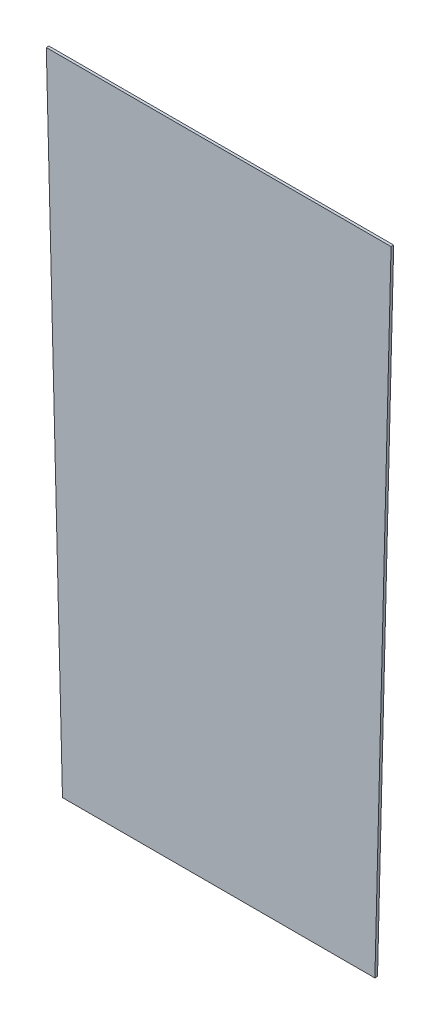
ISO-10303-21;
HEADER;
FILE_DESCRIPTION(('STEP AP214'),'2;1');
FILE_NAME('part.step','',(''),(''),'','','');
FILE_SCHEMA(('AUTOMOTIVE_DESIGN { 1 0 10303 214 1 1 1 1 }'));
ENDSEC;
DATA;
#1=APPLICATION_CONTEXT('core data for automotive mechanical design processes');
#2=APPLICATION_PROTOCOL_DEFINITION('international standard','automotive_design',2000,#1);
#3=PRODUCT_CONTEXT('',#1,'mechanical');
#4=PRODUCT('Part','Part','',(#3));
#5=PRODUCT_RELATED_PRODUCT_CATEGORY('part','',(#4));
#6=PRODUCT_DEFINITION_FORMATION('','',#4);
#7=PRODUCT_DEFINITION_CONTEXT('part definition',#1,'design');
#8=PRODUCT_DEFINITION('design','',#6,#7);
#9=PRODUCT_DEFINITION_SHAPE('','',#8);
#10=(LENGTH_UNIT() NAMED_UNIT(*) SI_UNIT(.MILLI.,.METRE.));
#11=(NAMED_UNIT(*) PLANE_ANGLE_UNIT() SI_UNIT($,.RADIAN.));
#12=(NAMED_UNIT(*) SI_UNIT($,.STERADIAN.) SOLID_ANGLE_UNIT());
#13=UNCERTAINTY_MEASURE_WITH_UNIT(LENGTH_MEASURE(1.E-05),#10,'distance_accuracy_value','');
#14=(GEOMETRIC_REPRESENTATION_CONTEXT(3) GLOBAL_UNCERTAINTY_ASSIGNED_CONTEXT((#13)) GLOBAL_UNIT_ASSIGNED_CONTEXT((#10,
#11,#12)) REPRESENTATION_CONTEXT('',''));
#15=CARTESIAN_POINT('',(0.,0.,0.));
#16=DIRECTION('',(0.,0.,1.));
#17=DIRECTION('',(1.,0.,0.));
#18=AXIS2_PLACEMENT_3D('',#15,#16,#17);
#19=CARTESIAN_POINT('',(56.788285952734,923.589027646681,3.6));
#20=DIRECTION('',(0.999682410973983,0.025200737871045,0.));
#21=DIRECTION('',(-0.025200737871045,0.999682410973983,0.));
#22=AXIS2_PLACEMENT_3D('',#19,#20,#21);
#23=PLANE('',#22);
#24=DIRECTION('',(0.025200737871045,-0.999682410973983,0.));
#25=VECTOR('',#24,1.);
#26=CARTESIAN_POINT('',(56.788285952734,923.589027646681,0.));
#27=LINE('',#26,#25);
#28=CARTESIAN_POINT('',(56.788285952734,923.589027646681,0.));
#29=VERTEX_POINT('',#28);
#30=CARTESIAN_POINT('',(78.9182859527341,45.7190276466816,0.));
#31=VERTEX_POINT('',#30);
#32=EDGE_CURVE('E102',#29,#31,#27,.T.);
#33=ORIENTED_EDGE('',*,*,#32,.T.);
#34=DIRECTION('',(0.,0.,-1.));
#35=VECTOR('',#34,1.);
#36=CARTESIAN_POINT('',(78.9182859527341,45.7190276466816,3.6));
#37=LINE('',#36,#35);
#38=CARTESIAN_POINT('',(78.9182859527341,45.7190276466816,3.6));
#39=VERTEX_POINT('',#38);
#40=EDGE_CURVE('E11',#39,#31,#37,.T.);
#41=ORIENTED_EDGE('',*,*,#40,.F.);
#42=DIRECTION('',(0.025200737871045,-0.999682410973983,0.));
#43=VECTOR('',#42,1.);
#44=CARTESIAN_POINT('',(56.788285952734,923.589027646681,3.6));
#45=LINE('',#44,#43);
#46=CARTESIAN_POINT('',(56.788285952734,923.589027646681,3.6));
#47=VERTEX_POINT('',#46);
#48=EDGE_CURVE('E90',#47,#39,#45,.T.);
#49=ORIENTED_EDGE('',*,*,#48,.F.);
#50=DIRECTION('',(0.,0.,-1.));
#51=VECTOR('',#50,1.);
#52=CARTESIAN_POINT('',(56.788285952734,923.589027646681,3.6));
#53=LINE('',#52,#51);
#54=EDGE_CURVE('E98',#47,#29,#53,.T.);
#55=ORIENTED_EDGE('',*,*,#54,.T.);
#56=EDGE_LOOP('',(#33,#41,#49,#55));
#57=FACE_BOUND('',#56,.T.);
#58=ADVANCED_FACE('F39',(#57),#23,.F.);
#59=CARTESIAN_POINT('',(78.9182859527341,45.7190276466816,3.6));
#60=DIRECTION('',(0.,1.,0.));
#61=DIRECTION('',(-1.,0.,0.));
#62=AXIS2_PLACEMENT_3D('',#59,#60,#61);
#63=PLANE('',#62);
#64=DIRECTION('',(1.,0.,0.));
#65=VECTOR('',#64,1.);
#66=CARTESIAN_POINT('',(78.9182859527341,45.7190276466816,0.));
#67=LINE('',#66,#65);
#68=CARTESIAN_POINT('',(506.418285952734,45.7190276466815,0.));
#69=VERTEX_POINT('',#68);
#70=EDGE_CURVE('E94',#31,#69,#67,.T.);
#71=ORIENTED_EDGE('',*,*,#70,.T.);
#72=DIRECTION('',(0.,0.,-1.));
#73=VECTOR('',#72,1.);
#74=CARTESIAN_POINT('',(506.418285952734,45.7190276466815,3.6));
#75=LINE('',#74,#73);
#76=CARTESIAN_POINT('',(506.418285952734,45.7190276466815,3.6));
#77=VERTEX_POINT('',#76);
#78=EDGE_CURVE('E47',#77,#69,#75,.T.);
#79=ORIENTED_EDGE('',*,*,#78,.F.);
#80=DIRECTION('',(1.,0.,0.));
#81=VECTOR('',#80,1.);
#82=CARTESIAN_POINT('',(78.9182859527341,45.7190276466816,3.6));
#83=LINE('',#82,#81);
#84=EDGE_CURVE('E85',#39,#77,#83,.T.);
#85=ORIENTED_EDGE('',*,*,#84,.F.);
#86=ORIENTED_EDGE('',*,*,#40,.T.);
#87=EDGE_LOOP('',(#71,#79,#85,#86));
#88=FACE_BOUND('',#87,.T.);
#89=ADVANCED_FACE('F93',(#88),#63,.F.);
#90=CARTESIAN_POINT('',(506.418285952734,45.7190276466815,3.6));
#91=DIRECTION('',(-0.999682410973983,0.0252007378710449,0.));
#92=DIRECTION('',(-0.0252007378710449,-0.999682410973983,0.));
#93=AXIS2_PLACEMENT_3D('',#90,#91,#92);
#94=PLANE('',#93);
#95=DIRECTION('',(0.0252007378710449,0.999682410973983,0.));
#96=VECTOR('',#95,1.);
#97=CARTESIAN_POINT('',(506.418285952734,45.7190276466815,0.));
#98=LINE('',#97,#96);
#99=CARTESIAN_POINT('',(528.548285952734,923.589027646682,0.));
#100=VERTEX_POINT('',#99);
#101=EDGE_CURVE('E72',#69,#100,#98,.T.);
#102=ORIENTED_EDGE('',*,*,#101,.T.);
#103=DIRECTION('',(0.,0.,-1.));
#104=VECTOR('',#103,1.);
#105=CARTESIAN_POINT('',(528.548285952734,923.589027646682,3.6));
#106=LINE('',#105,#104);
#107=CARTESIAN_POINT('',(528.548285952734,923.589027646682,3.6));
#108=VERTEX_POINT('',#107);
#109=EDGE_CURVE('E95',#108,#100,#106,.T.);
#110=ORIENTED_EDGE('',*,*,#109,.F.);
#111=DIRECTION('',(0.0252007378710449,0.999682410973983,0.));
#112=VECTOR('',#111,1.);
#113=CARTESIAN_POINT('',(506.418285952734,45.7190276466815,3.6));
#114=LINE('',#113,#112);
#115=EDGE_CURVE('E88',#77,#108,#114,.T.);
#116=ORIENTED_EDGE('',*,*,#115,.F.);
#117=ORIENTED_EDGE('',*,*,#78,.T.);
#118=EDGE_LOOP('',(#102,#110,#116,#117));
#119=FACE_BOUND('',#118,.T.);
#120=ADVANCED_FACE('F96',(#119),#94,.F.);
#121=CARTESIAN_POINT('',(528.548285952734,923.589027646682,3.6));
#122=DIRECTION('',(0.,-1.,0.));
#123=DIRECTION('',(1.,0.,0.));
#124=AXIS2_PLACEMENT_3D('',#121,#122,#123);
#125=PLANE('',#124);
#126=DIRECTION('',(-1.,0.,0.));
#127=VECTOR('',#126,1.);
#128=CARTESIAN_POINT('',(528.548285952734,923.589027646682,0.));
#129=LINE('',#128,#127);
#130=EDGE_CURVE('E78',#100,#29,#129,.T.);
#131=ORIENTED_EDGE('',*,*,#130,.T.);
#132=ORIENTED_EDGE('',*,*,#54,.F.);
#133=DIRECTION('',(-1.,0.,0.));
#134=VECTOR('',#133,1.);
#135=CARTESIAN_POINT('',(528.548285952734,923.589027646682,3.6));
#136=LINE('',#135,#134);
#137=EDGE_CURVE('E55',#108,#47,#136,.T.);
#138=ORIENTED_EDGE('',*,*,#137,.F.);
#139=ORIENTED_EDGE('',*,*,#109,.T.);
#140=EDGE_LOOP('',(#131,#132,#138,#139));
#141=FACE_BOUND('',#140,.T.);
#142=ADVANCED_FACE('F109',(#141),#125,.F.);
#143=CARTESIAN_POINT('',(0.,0.,3.6));
#144=DIRECTION('',(0.,0.,1.));
#145=DIRECTION('',(1.,0.,0.));
#146=AXIS2_PLACEMENT_3D('',#143,#144,#145);
#147=PLANE('',#146);
#148=ORIENTED_EDGE('',*,*,#48,.T.);
#149=ORIENTED_EDGE('',*,*,#84,.T.);
#150=ORIENTED_EDGE('',*,*,#115,.T.);
#151=ORIENTED_EDGE('',*,*,#137,.T.);
#152=EDGE_LOOP('',(#148,#149,#150,#151));
#153=FACE_BOUND('',#152,.T.);
#154=ADVANCED_FACE('F86',(#153),#147,.T.);
#155=CARTESIAN_POINT('',(0.,0.,0.));
#156=DIRECTION('',(0.,0.,1.));
#157=DIRECTION('',(1.,0.,0.));
#158=AXIS2_PLACEMENT_3D('',#155,#156,#157);
#159=PLANE('',#158);
#160=ORIENTED_EDGE('',*,*,#32,.F.);
#161=ORIENTED_EDGE('',*,*,#130,.F.);
#162=ORIENTED_EDGE('',*,*,#101,.F.);
#163=ORIENTED_EDGE('',*,*,#70,.F.);
#164=EDGE_LOOP('',(#160,#161,#162,#163));
#165=FACE_BOUND('',#164,.T.);
#166=ADVANCED_FACE('F112',(#165),#159,.F.);
#167=CLOSED_SHELL('',(#58,#89,#120,#142,#154,#166));
#168=MANIFOLD_SOLID_BREP('B2',#167);
#169=ADVANCED_BREP_SHAPE_REPRESENTATION('',(#18,#168),#14);
#170=SHAPE_DEFINITION_REPRESENTATION(#9,#169);
ENDSEC;
END-ISO-10303-21;
